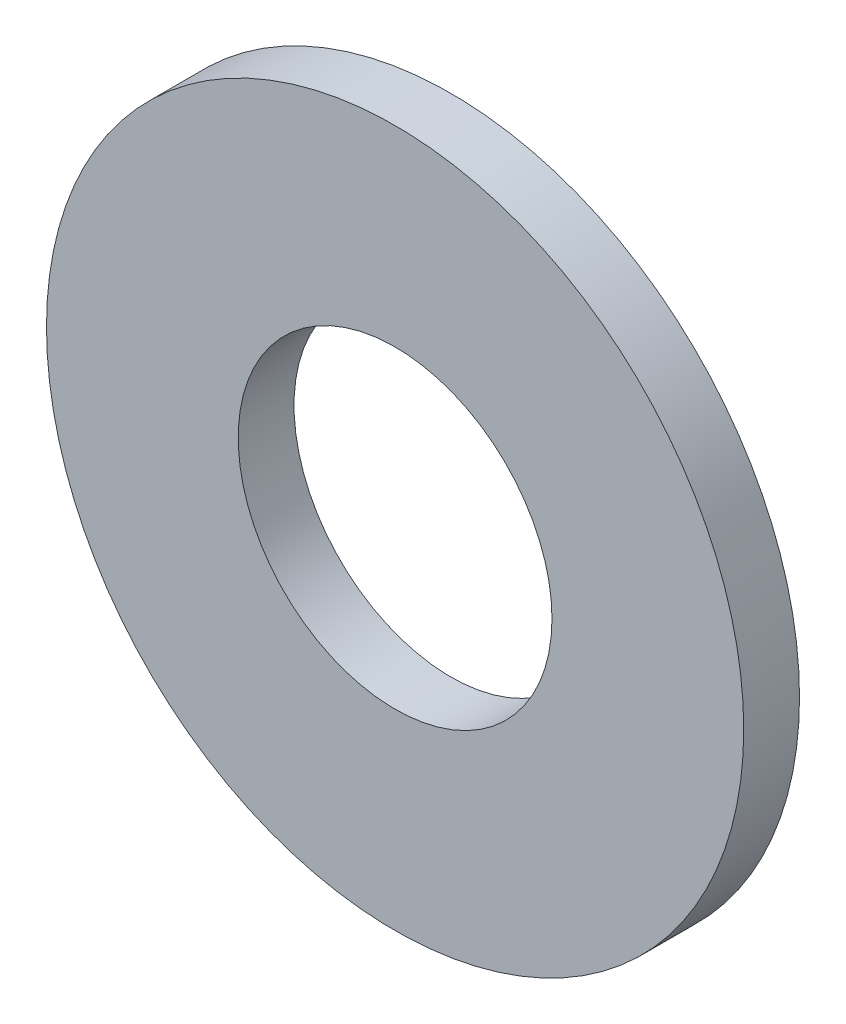
ISO-10303-21;
HEADER;
FILE_DESCRIPTION(('STEP AP214'),'2;1');
FILE_NAME('part.step','',(''),(''),'','','');
FILE_SCHEMA(('AUTOMOTIVE_DESIGN { 1 0 10303 214 1 1 1 1 }'));
ENDSEC;
DATA;
#1=APPLICATION_CONTEXT('core data for automotive mechanical design processes');
#2=APPLICATION_PROTOCOL_DEFINITION('international standard','automotive_design',2000,#1);
#3=PRODUCT_CONTEXT('',#1,'mechanical');
#4=PRODUCT('Part','Part','',(#3));
#5=PRODUCT_RELATED_PRODUCT_CATEGORY('part','',(#4));
#6=PRODUCT_DEFINITION_FORMATION('','',#4);
#7=PRODUCT_DEFINITION_CONTEXT('part definition',#1,'design');
#8=PRODUCT_DEFINITION('design','',#6,#7);
#9=PRODUCT_DEFINITION_SHAPE('','',#8);
#10=(LENGTH_UNIT() NAMED_UNIT(*) SI_UNIT(.MILLI.,.METRE.));
#11=(NAMED_UNIT(*) PLANE_ANGLE_UNIT() SI_UNIT($,.RADIAN.));
#12=(NAMED_UNIT(*) SI_UNIT($,.STERADIAN.) SOLID_ANGLE_UNIT());
#13=UNCERTAINTY_MEASURE_WITH_UNIT(LENGTH_MEASURE(1.E-05),#10,'distance_accuracy_value','');
#14=(GEOMETRIC_REPRESENTATION_CONTEXT(3) GLOBAL_UNCERTAINTY_ASSIGNED_CONTEXT((#13)) GLOBAL_UNIT_ASSIGNED_CONTEXT((#10,
#11,#12)) REPRESENTATION_CONTEXT('',''));
#15=CARTESIAN_POINT('',(0.,0.,0.));
#16=DIRECTION('',(0.,0.,1.));
#17=DIRECTION('',(1.,0.,0.));
#18=AXIS2_PLACEMENT_3D('',#15,#16,#17);
#19=CARTESIAN_POINT('',(0.,0.,-1.27));
#20=DIRECTION('',(0.,0.,1.));
#21=DIRECTION('',(1.,0.,0.));
#22=AXIS2_PLACEMENT_3D('',#19,#20,#21);
#23=CYLINDRICAL_SURFACE('',#22,7.9375);
#24=CARTESIAN_POINT('',(0.,0.,-1.27));
#25=DIRECTION('',(0.,0.,1.));
#26=DIRECTION('',(1.,0.,0.));
#27=AXIS2_PLACEMENT_3D('',#24,#25,#26);
#28=CIRCLE('',#27,7.9375);
#29=CARTESIAN_POINT('',(7.9375,0.,-1.27));
#30=VERTEX_POINT('',#29);
#31=EDGE_CURVE('E10',#30,#30,#28,.T.);
#32=ORIENTED_EDGE('',*,*,#31,.T.);
#33=EDGE_LOOP('',(#32));
#34=FACE_BOUND('',#33,.T.);
#35=CARTESIAN_POINT('',(0.,0.,0.));
#36=DIRECTION('',(0.,0.,1.));
#37=DIRECTION('',(1.,0.,0.));
#38=AXIS2_PLACEMENT_3D('',#35,#36,#37);
#39=CIRCLE('',#38,7.9375);
#40=CARTESIAN_POINT('',(7.9375,0.,0.));
#41=VERTEX_POINT('',#40);
#42=EDGE_CURVE('E37',#41,#41,#39,.T.);
#43=ORIENTED_EDGE('',*,*,#42,.F.);
#44=EDGE_LOOP('',(#43));
#45=FACE_BOUND('',#44,.T.);
#46=ADVANCED_FACE('F34',(#34,#45),#23,.T.);
#47=CARTESIAN_POINT('',(0.,0.,-1.27));
#48=DIRECTION('',(0.,0.,1.));
#49=DIRECTION('',(1.,0.,0.));
#50=AXIS2_PLACEMENT_3D('',#47,#48,#49);
#51=PLANE('',#50);
#52=CARTESIAN_POINT('',(0.,0.,-1.27));
#53=DIRECTION('',(0.,0.,1.));
#54=DIRECTION('',(1.,0.,0.));
#55=AXIS2_PLACEMENT_3D('',#52,#53,#54);
#56=CIRCLE('',#55,3.571875);
#57=CARTESIAN_POINT('',(3.571875,0.,-1.27));
#58=VERTEX_POINT('',#57);
#59=EDGE_CURVE('E47',#58,#58,#56,.T.);
#60=ORIENTED_EDGE('',*,*,#59,.T.);
#61=EDGE_LOOP('',(#60));
#62=FACE_BOUND('',#61,.T.);
#63=ORIENTED_EDGE('',*,*,#31,.F.);
#64=EDGE_LOOP('',(#63));
#65=FACE_BOUND('',#64,.T.);
#66=ADVANCED_FACE('F56',(#62,#65),#51,.F.);
#67=CARTESIAN_POINT('',(0.,0.,0.));
#68=DIRECTION('',(0.,0.,1.));
#69=DIRECTION('',(1.,0.,0.));
#70=AXIS2_PLACEMENT_3D('',#67,#68,#69);
#71=PLANE('',#70);
#72=CARTESIAN_POINT('',(0.,0.,0.));
#73=DIRECTION('',(0.,0.,1.));
#74=DIRECTION('',(1.,0.,0.));
#75=AXIS2_PLACEMENT_3D('',#72,#73,#74);
#76=CIRCLE('',#75,3.571875);
#77=CARTESIAN_POINT('',(3.571875,0.,0.));
#78=VERTEX_POINT('',#77);
#79=EDGE_CURVE('E49',#78,#78,#76,.T.);
#80=ORIENTED_EDGE('',*,*,#79,.F.);
#81=EDGE_LOOP('',(#80));
#82=FACE_BOUND('',#81,.T.);
#83=ORIENTED_EDGE('',*,*,#42,.T.);
#84=EDGE_LOOP('',(#83));
#85=FACE_BOUND('',#84,.T.);
#86=ADVANCED_FACE('F62',(#82,#85),#71,.T.);
#87=CARTESIAN_POINT('',(0.,0.,-1.27));
#88=DIRECTION('',(0.,0.,1.));
#89=DIRECTION('',(1.,0.,0.));
#90=AXIS2_PLACEMENT_3D('',#87,#88,#89);
#91=CYLINDRICAL_SURFACE('',#90,3.571875);
#92=ORIENTED_EDGE('',*,*,#59,.F.);
#93=EDGE_LOOP('',(#92));
#94=FACE_BOUND('',#93,.T.);
#95=ORIENTED_EDGE('',*,*,#79,.T.);
#96=EDGE_LOOP('',(#95));
#97=FACE_BOUND('',#96,.T.);
#98=ADVANCED_FACE('F59',(#94,#97),#91,.F.);
#99=CLOSED_SHELL('',(#46,#66,#86,#98));
#100=MANIFOLD_SOLID_BREP('B2',#99);
#101=ADVANCED_BREP_SHAPE_REPRESENTATION('',(#18,#100),#14);
#102=SHAPE_DEFINITION_REPRESENTATION(#9,#101);
ENDSEC;
END-ISO-10303-21;
